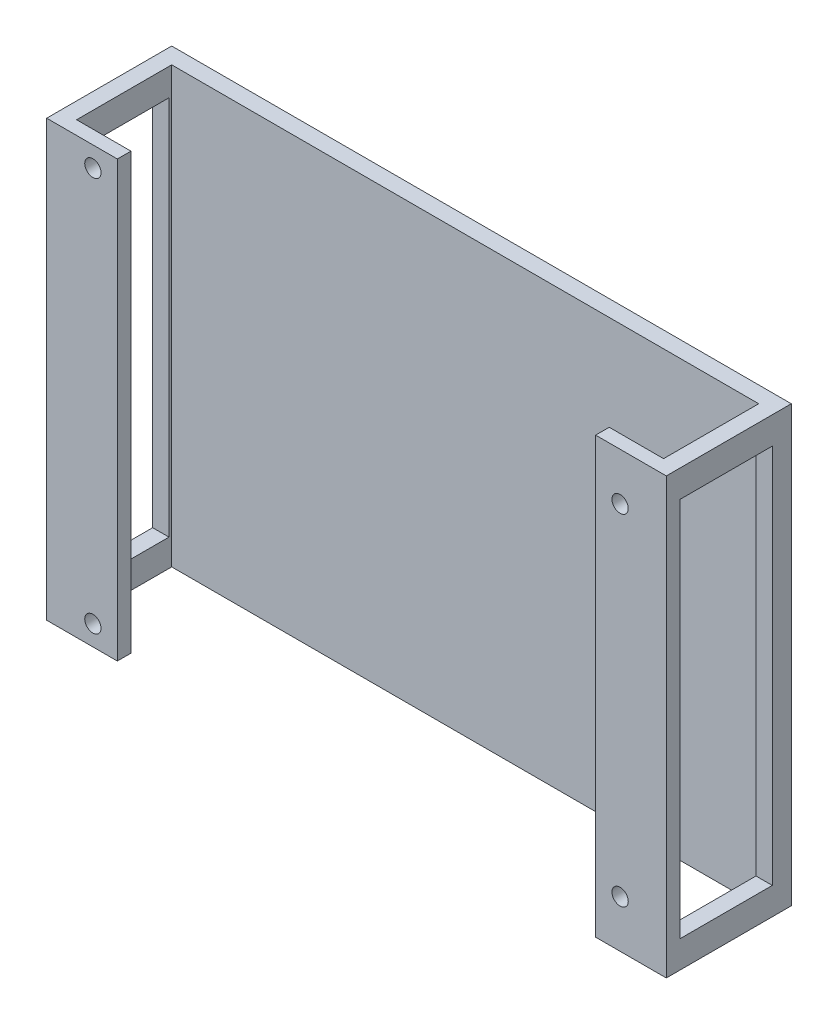
ISO-10303-21;
HEADER;
FILE_DESCRIPTION(('STEP AP214'),'2;1');
FILE_NAME('part.step','',(''),(''),'','','');
FILE_SCHEMA(('AUTOMOTIVE_DESIGN { 1 0 10303 214 1 1 1 1 }'));
ENDSEC;
DATA;
#1=APPLICATION_CONTEXT('core data for automotive mechanical design processes');
#2=APPLICATION_PROTOCOL_DEFINITION('international standard','automotive_design',2000,#1);
#3=PRODUCT_CONTEXT('',#1,'mechanical');
#4=PRODUCT('Part','Part','',(#3));
#5=PRODUCT_RELATED_PRODUCT_CATEGORY('part','',(#4));
#6=PRODUCT_DEFINITION_FORMATION('','',#4);
#7=PRODUCT_DEFINITION_CONTEXT('part definition',#1,'design');
#8=PRODUCT_DEFINITION('design','',#6,#7);
#9=PRODUCT_DEFINITION_SHAPE('','',#8);
#10=(LENGTH_UNIT() NAMED_UNIT(*) SI_UNIT(.MILLI.,.METRE.));
#11=(NAMED_UNIT(*) PLANE_ANGLE_UNIT() SI_UNIT($,.RADIAN.));
#12=(NAMED_UNIT(*) SI_UNIT($,.STERADIAN.) SOLID_ANGLE_UNIT());
#13=UNCERTAINTY_MEASURE_WITH_UNIT(LENGTH_MEASURE(1.E-05),#10,'distance_accuracy_value','');
#14=(GEOMETRIC_REPRESENTATION_CONTEXT(3) GLOBAL_UNCERTAINTY_ASSIGNED_CONTEXT((#13)) GLOBAL_UNIT_ASSIGNED_CONTEXT((#10,
#11,#12)) REPRESENTATION_CONTEXT('',''));
#15=CARTESIAN_POINT('',(0.,0.,0.));
#16=DIRECTION('',(0.,0.,1.));
#17=DIRECTION('',(1.,0.,0.));
#18=AXIS2_PLACEMENT_3D('',#15,#16,#17);
#19=CARTESIAN_POINT('',(-33.0737867172707,67.4355554296559,3.));
#20=DIRECTION('',(1.,0.,0.));
#21=DIRECTION('',(0.,1.,0.));
#22=AXIS2_PLACEMENT_3D('',#19,#20,#21);
#23=PLANE('',#22);
#24=DIRECTION('',(0.,-1.,0.));
#25=VECTOR('',#24,1.);
#26=CARTESIAN_POINT('',(-33.0737867172707,67.4355554296559,0.));
#27=LINE('',#26,#25);
#28=CARTESIAN_POINT('',(-33.0737867172707,67.4355554296559,0.));
#29=VERTEX_POINT('',#28);
#30=CARTESIAN_POINT('',(-33.0737867172707,-12.5644445703441,0.));
#31=VERTEX_POINT('',#30);
#32=EDGE_CURVE('E334',#29,#31,#27,.T.);
#33=ORIENTED_EDGE('',*,*,#32,.T.);
#34=DIRECTION('',(0.,0.,-1.));
#35=VECTOR('',#34,1.);
#36=CARTESIAN_POINT('',(-33.0737867172707,-12.5644445703441,3.));
#37=LINE('',#36,#35);
#38=CARTESIAN_POINT('',(-33.0737867172707,-12.5644445703441,23.));
#39=VERTEX_POINT('',#38);
#40=EDGE_CURVE('E336',#39,#31,#37,.T.);
#41=ORIENTED_EDGE('',*,*,#40,.F.);
#42=DIRECTION('',(0.,1.,0.));
#43=VECTOR('',#42,1.);
#44=CARTESIAN_POINT('',(-33.0737867172707,-12.5644445703441,23.));
#45=LINE('',#44,#43);
#46=CARTESIAN_POINT('',(-33.0737867172707,67.4355554296559,23.));
#47=VERTEX_POINT('',#46);
#48=EDGE_CURVE('E310',#39,#47,#45,.T.);
#49=ORIENTED_EDGE('',*,*,#48,.T.);
#50=DIRECTION('',(0.,0.,-1.));
#51=VECTOR('',#50,1.);
#52=CARTESIAN_POINT('',(-33.0737867172707,67.4355554296559,3.));
#53=LINE('',#52,#51);
#54=EDGE_CURVE('E338',#47,#29,#53,.T.);
#55=ORIENTED_EDGE('',*,*,#54,.T.);
#56=EDGE_LOOP('',(#33,#41,#49,#55));
#57=FACE_BOUND('',#56,.T.);
#58=DIRECTION('',(0.,1.,0.));
#59=VECTOR('',#58,1.);
#60=CARTESIAN_POINT('',(-33.0737867172707,-7.56444457034407,20.5));
#61=LINE('',#60,#59);
#62=CARTESIAN_POINT('',(-33.0737867172707,-7.56444457034407,20.5));
#63=VERTEX_POINT('',#62);
#64=CARTESIAN_POINT('',(-33.0737867172707,62.4355554296559,20.5));
#65=VERTEX_POINT('',#64);
#66=EDGE_CURVE('E203',#63,#65,#61,.T.);
#67=ORIENTED_EDGE('',*,*,#66,.F.);
#68=DIRECTION('',(0.,0.,1.));
#69=VECTOR('',#68,1.);
#70=CARTESIAN_POINT('',(-33.0737867172707,-7.56444457034407,3.5));
#71=LINE('',#70,#69);
#72=CARTESIAN_POINT('',(-33.0737867172707,-7.56444457034407,3.5));
#73=VERTEX_POINT('',#72);
#74=EDGE_CURVE('E181',#73,#63,#71,.T.);
#75=ORIENTED_EDGE('',*,*,#74,.F.);
#76=DIRECTION('',(0.,-1.,0.));
#77=VECTOR('',#76,1.);
#78=CARTESIAN_POINT('',(-33.0737867172707,62.4355554296559,3.49999999999999));
#79=LINE('',#78,#77);
#80=CARTESIAN_POINT('',(-33.0737867172707,62.4355554296559,3.49999999999999));
#81=VERTEX_POINT('',#80);
#82=EDGE_CURVE('E195',#81,#73,#79,.T.);
#83=ORIENTED_EDGE('',*,*,#82,.F.);
#84=DIRECTION('',(0.,0.,-1.));
#85=VECTOR('',#84,1.);
#86=CARTESIAN_POINT('',(-33.0737867172707,62.4355554296559,3.49999999999999));
#87=LINE('',#86,#85);
#88=EDGE_CURVE('E206',#65,#81,#87,.T.);
#89=ORIENTED_EDGE('',*,*,#88,.F.);
#90=EDGE_LOOP('',(#67,#75,#83,#89));
#91=FACE_BOUND('',#90,.T.);
#92=ADVANCED_FACE('F41',(#57,#91),#23,.F.);
#93=CARTESIAN_POINT('',(0.,0.,3.));
#94=DIRECTION('',(0.,0.,1.));
#95=DIRECTION('',(1.,0.,0.));
#96=AXIS2_PLACEMENT_3D('',#93,#94,#95);
#97=PLANE('',#96);
#98=DIRECTION('',(0.,-1.,0.));
#99=VECTOR('',#98,1.);
#100=CARTESIAN_POINT('',(77.9262132827293,67.4355554296559,3.));
#101=LINE('',#100,#99);
#102=CARTESIAN_POINT('',(77.9262132827293,67.4355554296559,3.));
#103=VERTEX_POINT('',#102);
#104=CARTESIAN_POINT('',(77.9262132827293,-12.5644445703441,3.));
#105=VERTEX_POINT('',#104);
#106=EDGE_CURVE('E272',#103,#105,#101,.T.);
#107=ORIENTED_EDGE('',*,*,#106,.F.);
#108=DIRECTION('',(-1.,0.,0.));
#109=VECTOR('',#108,1.);
#110=CARTESIAN_POINT('',(-33.0737867172707,67.4355554296559,3.));
#111=LINE('',#110,#109);
#112=CARTESIAN_POINT('',(-30.0737867172707,67.4355554296559,3.));
#113=VERTEX_POINT('',#112);
#114=EDGE_CURVE('E318',#103,#113,#111,.T.);
#115=ORIENTED_EDGE('',*,*,#114,.T.);
#116=DIRECTION('',(0.,-1.,0.));
#117=VECTOR('',#116,1.);
#118=CARTESIAN_POINT('',(-30.0737867172707,67.4355554296559,3.));
#119=LINE('',#118,#117);
#120=CARTESIAN_POINT('',(-30.0737867172707,-12.5644445703441,3.));
#121=VERTEX_POINT('',#120);
#122=EDGE_CURVE('E303',#113,#121,#119,.T.);
#123=ORIENTED_EDGE('',*,*,#122,.T.);
#124=DIRECTION('',(1.,0.,0.));
#125=VECTOR('',#124,1.);
#126=CARTESIAN_POINT('',(-33.0737867172707,-12.5644445703441,3.));
#127=LINE('',#126,#125);
#128=EDGE_CURVE('E321',#121,#105,#127,.T.);
#129=ORIENTED_EDGE('',*,*,#128,.T.);
#130=EDGE_LOOP('',(#107,#115,#123,#129));
#131=FACE_BOUND('',#130,.T.);
#132=ADVANCED_FACE('F371',(#131),#97,.T.);
#133=CARTESIAN_POINT('',(80.9262132827293,67.4355554296559,3.));
#134=DIRECTION('',(-1.,0.,0.));
#135=DIRECTION('',(0.,-1.,0.));
#136=AXIS2_PLACEMENT_3D('',#133,#134,#135);
#137=PLANE('',#136);
#138=DIRECTION('',(0.,0.,1.));
#139=VECTOR('',#138,1.);
#140=CARTESIAN_POINT('',(80.9262132827293,-7.56444457034406,3.5));
#141=LINE('',#140,#139);
#142=CARTESIAN_POINT('',(80.9262132827293,-7.56444457034406,3.5));
#143=VERTEX_POINT('',#142);
#144=CARTESIAN_POINT('',(80.9262132827293,-7.56444457034406,20.5));
#145=VERTEX_POINT('',#144);
#146=EDGE_CURVE('E234',#143,#145,#141,.T.);
#147=ORIENTED_EDGE('',*,*,#146,.T.);
#148=DIRECTION('',(0.,1.,0.));
#149=VECTOR('',#148,1.);
#150=CARTESIAN_POINT('',(80.9262132827293,-7.56444457034406,20.5));
#151=LINE('',#150,#149);
#152=CARTESIAN_POINT('',(80.9262132827293,62.4355554296559,20.5));
#153=VERTEX_POINT('',#152);
#154=EDGE_CURVE('E201',#145,#153,#151,.T.);
#155=ORIENTED_EDGE('',*,*,#154,.T.);
#156=DIRECTION('',(0.,0.,-1.));
#157=VECTOR('',#156,1.);
#158=CARTESIAN_POINT('',(80.9262132827293,62.4355554296559,3.49999999999999));
#159=LINE('',#158,#157);
#160=CARTESIAN_POINT('',(80.9262132827293,62.4355554296559,3.49999999999999));
#161=VERTEX_POINT('',#160);
#162=EDGE_CURVE('E191',#153,#161,#159,.T.);
#163=ORIENTED_EDGE('',*,*,#162,.T.);
#164=DIRECTION('',(0.,-1.,0.));
#165=VECTOR('',#164,1.);
#166=CARTESIAN_POINT('',(80.9262132827293,62.4355554296559,3.49999999999999));
#167=LINE('',#166,#165);
#168=EDGE_CURVE('E67',#161,#143,#167,.T.);
#169=ORIENTED_EDGE('',*,*,#168,.T.);
#170=EDGE_LOOP('',(#147,#155,#163,#169));
#171=FACE_BOUND('',#170,.T.);
#172=DIRECTION('',(0.,1.,0.));
#173=VECTOR('',#172,1.);
#174=CARTESIAN_POINT('',(80.9262132827293,67.4355554296559,0.));
#175=LINE('',#174,#173);
#176=CARTESIAN_POINT('',(80.9262132827293,-12.5644445703441,0.));
#177=VERTEX_POINT('',#176);
#178=CARTESIAN_POINT('',(80.9262132827293,67.4355554296559,0.));
#179=VERTEX_POINT('',#178);
#180=EDGE_CURVE('E320',#177,#179,#175,.T.);
#181=ORIENTED_EDGE('',*,*,#180,.T.);
#182=DIRECTION('',(0.,0.,-1.));
#183=VECTOR('',#182,1.);
#184=CARTESIAN_POINT('',(80.9262132827293,67.4355554296559,3.));
#185=LINE('',#184,#183);
#186=CARTESIAN_POINT('',(80.9262132827293,67.4355554296559,23.));
#187=VERTEX_POINT('',#186);
#188=EDGE_CURVE('E341',#187,#179,#185,.T.);
#189=ORIENTED_EDGE('',*,*,#188,.F.);
#190=DIRECTION('',(0.,1.,0.));
#191=VECTOR('',#190,1.);
#192=CARTESIAN_POINT('',(80.9262132827293,-12.5644445703441,23.));
#193=LINE('',#192,#191);
#194=CARTESIAN_POINT('',(80.9262132827293,-12.5644445703441,23.));
#195=VERTEX_POINT('',#194);
#196=EDGE_CURVE('E276',#195,#187,#193,.T.);
#197=ORIENTED_EDGE('',*,*,#196,.F.);
#198=DIRECTION('',(0.,0.,-1.));
#199=VECTOR('',#198,1.);
#200=CARTESIAN_POINT('',(80.9262132827293,-12.5644445703441,3.));
#201=LINE('',#200,#199);
#202=EDGE_CURVE('E327',#195,#177,#201,.T.);
#203=ORIENTED_EDGE('',*,*,#202,.T.);
#204=EDGE_LOOP('',(#181,#189,#197,#203));
#205=FACE_BOUND('',#204,.T.);
#206=ADVANCED_FACE('F43',(#171,#205),#137,.F.);
#207=CARTESIAN_POINT('',(-33.0737867172707,67.4355554296559,3.));
#208=DIRECTION('',(0.,-1.,0.));
#209=DIRECTION('',(0.,0.,-1.));
#210=AXIS2_PLACEMENT_3D('',#207,#208,#209);
#211=PLANE('',#210);
#212=DIRECTION('',(-1.,0.,0.));
#213=VECTOR('',#212,1.);
#214=CARTESIAN_POINT('',(-33.0737867172707,67.4355554296559,0.));
#215=LINE('',#214,#213);
#216=EDGE_CURVE('E326',#179,#29,#215,.T.);
#217=ORIENTED_EDGE('',*,*,#216,.T.);
#218=ORIENTED_EDGE('',*,*,#54,.F.);
#219=DIRECTION('',(1.,0.,0.));
#220=VECTOR('',#219,1.);
#221=CARTESIAN_POINT('',(-33.0737867172707,67.4355554296559,23.));
#222=LINE('',#221,#220);
#223=CARTESIAN_POINT('',(-20.0737867172707,67.4355554296559,23.));
#224=VERTEX_POINT('',#223);
#225=EDGE_CURVE('E309',#47,#224,#222,.T.);
#226=ORIENTED_EDGE('',*,*,#225,.T.);
#227=DIRECTION('',(0.,0.,1.));
#228=VECTOR('',#227,1.);
#229=CARTESIAN_POINT('',(-20.0737867172707,67.4355554296559,23.));
#230=LINE('',#229,#228);
#231=CARTESIAN_POINT('',(-20.0737867172707,67.4355554296559,20.5));
#232=VERTEX_POINT('',#231);
#233=EDGE_CURVE('E295',#232,#224,#230,.T.);
#234=ORIENTED_EDGE('',*,*,#233,.F.);
#235=DIRECTION('',(-1.,0.,0.));
#236=VECTOR('',#235,1.);
#237=CARTESIAN_POINT('',(-20.0737867172707,67.4355554296559,20.5));
#238=LINE('',#237,#236);
#239=CARTESIAN_POINT('',(-30.0737867172707,67.4355554296559,20.5));
#240=VERTEX_POINT('',#239);
#241=EDGE_CURVE('E300',#232,#240,#238,.T.);
#242=ORIENTED_EDGE('',*,*,#241,.T.);
#243=DIRECTION('',(0.,0.,-1.));
#244=VECTOR('',#243,1.);
#245=CARTESIAN_POINT('',(-30.0737867172707,67.4355554296559,23.));
#246=LINE('',#245,#244);
#247=EDGE_CURVE('E315',#240,#113,#246,.T.);
#248=ORIENTED_EDGE('',*,*,#247,.T.);
#249=ORIENTED_EDGE('',*,*,#114,.F.);
#250=DIRECTION('',(0.,0.,-1.));
#251=VECTOR('',#250,1.);
#252=CARTESIAN_POINT('',(77.9262132827293,67.4355554296559,23.));
#253=LINE('',#252,#251);
#254=CARTESIAN_POINT('',(77.9262132827293,67.4355554296559,20.5));
#255=VERTEX_POINT('',#254);
#256=EDGE_CURVE('E285',#255,#103,#253,.T.);
#257=ORIENTED_EDGE('',*,*,#256,.F.);
#258=DIRECTION('',(1.,0.,0.));
#259=VECTOR('',#258,1.);
#260=CARTESIAN_POINT('',(67.9262132827293,67.4355554296559,20.5));
#261=LINE('',#260,#259);
#262=CARTESIAN_POINT('',(67.9262132827293,67.4355554296559,20.5));
#263=VERTEX_POINT('',#262);
#264=EDGE_CURVE('E267',#263,#255,#261,.T.);
#265=ORIENTED_EDGE('',*,*,#264,.F.);
#266=DIRECTION('',(0.,0.,1.));
#267=VECTOR('',#266,1.);
#268=CARTESIAN_POINT('',(67.9262132827293,67.4355554296559,23.));
#269=LINE('',#268,#267);
#270=CARTESIAN_POINT('',(67.9262132827293,67.4355554296559,23.));
#271=VERTEX_POINT('',#270);
#272=EDGE_CURVE('E253',#263,#271,#269,.T.);
#273=ORIENTED_EDGE('',*,*,#272,.T.);
#274=DIRECTION('',(-1.,0.,0.));
#275=VECTOR('',#274,1.);
#276=CARTESIAN_POINT('',(80.9262132827293,67.4355554296559,23.));
#277=LINE('',#276,#275);
#278=EDGE_CURVE('E273',#187,#271,#277,.T.);
#279=ORIENTED_EDGE('',*,*,#278,.F.);
#280=ORIENTED_EDGE('',*,*,#188,.T.);
#281=EDGE_LOOP('',(#217,#218,#226,#234,#242,#248,#249,#257,#265,#273,#279,#280));
#282=FACE_BOUND('',#281,.T.);
#283=ADVANCED_FACE('F381',(#282),#211,.F.);
#284=CARTESIAN_POINT('',(-33.0737867172707,-12.5644445703441,3.));
#285=DIRECTION('',(0.,1.,0.));
#286=DIRECTION('',(0.,0.,1.));
#287=AXIS2_PLACEMENT_3D('',#284,#285,#286);
#288=PLANE('',#287);
#289=ORIENTED_EDGE('',*,*,#128,.F.);
#290=DIRECTION('',(0.,0.,-1.));
#291=VECTOR('',#290,1.);
#292=CARTESIAN_POINT('',(-30.0737867172707,-12.5644445703441,23.));
#293=LINE('',#292,#291);
#294=CARTESIAN_POINT('',(-30.0737867172707,-12.5644445703441,20.5));
#295=VERTEX_POINT('',#294);
#296=EDGE_CURVE('E314',#295,#121,#293,.T.);
#297=ORIENTED_EDGE('',*,*,#296,.F.);
#298=DIRECTION('',(-1.,0.,0.));
#299=VECTOR('',#298,1.);
#300=CARTESIAN_POINT('',(-20.0737867172707,-12.5644445703441,20.5));
#301=LINE('',#300,#299);
#302=CARTESIAN_POINT('',(-20.0737867172707,-12.5644445703441,20.5));
#303=VERTEX_POINT('',#302);
#304=EDGE_CURVE('E301',#303,#295,#301,.T.);
#305=ORIENTED_EDGE('',*,*,#304,.F.);
#306=DIRECTION('',(0.,0.,-1.));
#307=VECTOR('',#306,1.);
#308=CARTESIAN_POINT('',(-20.0737867172707,-12.5644445703441,20.5));
#309=LINE('',#308,#307);
#310=CARTESIAN_POINT('',(-20.0737867172707,-12.5644445703441,23.));
#311=VERTEX_POINT('',#310);
#312=EDGE_CURVE('E286',#311,#303,#309,.T.);
#313=ORIENTED_EDGE('',*,*,#312,.F.);
#314=DIRECTION('',(-1.,0.,0.));
#315=VECTOR('',#314,1.);
#316=CARTESIAN_POINT('',(-30.0737867172707,-12.5644445703441,23.));
#317=LINE('',#316,#315);
#318=EDGE_CURVE('E302',#311,#39,#317,.T.);
#319=ORIENTED_EDGE('',*,*,#318,.T.);
#320=ORIENTED_EDGE('',*,*,#40,.T.);
#321=DIRECTION('',(1.,0.,0.));
#322=VECTOR('',#321,1.);
#323=CARTESIAN_POINT('',(-33.0737867172707,-12.5644445703441,0.));
#324=LINE('',#323,#322);
#325=EDGE_CURVE('E325',#31,#177,#324,.T.);
#326=ORIENTED_EDGE('',*,*,#325,.T.);
#327=ORIENTED_EDGE('',*,*,#202,.F.);
#328=DIRECTION('',(1.,0.,0.));
#329=VECTOR('',#328,1.);
#330=CARTESIAN_POINT('',(77.9262132827293,-12.5644445703441,23.));
#331=LINE('',#330,#329);
#332=CARTESIAN_POINT('',(67.9262132827293,-12.5644445703441,23.));
#333=VERTEX_POINT('',#332);
#334=EDGE_CURVE('E275',#333,#195,#331,.T.);
#335=ORIENTED_EDGE('',*,*,#334,.F.);
#336=DIRECTION('',(0.,0.,-1.));
#337=VECTOR('',#336,1.);
#338=CARTESIAN_POINT('',(67.9262132827293,-12.5644445703441,20.5));
#339=LINE('',#338,#337);
#340=CARTESIAN_POINT('',(67.9262132827293,-12.5644445703441,20.5));
#341=VERTEX_POINT('',#340);
#342=EDGE_CURVE('E262',#333,#341,#339,.T.);
#343=ORIENTED_EDGE('',*,*,#342,.T.);
#344=DIRECTION('',(1.,0.,0.));
#345=VECTOR('',#344,1.);
#346=CARTESIAN_POINT('',(67.9262132827293,-12.5644445703441,20.5));
#347=LINE('',#346,#345);
#348=CARTESIAN_POINT('',(77.9262132827293,-12.5644445703441,20.5));
#349=VERTEX_POINT('',#348);
#350=EDGE_CURVE('E261',#341,#349,#347,.T.);
#351=ORIENTED_EDGE('',*,*,#350,.T.);
#352=DIRECTION('',(0.,0.,-1.));
#353=VECTOR('',#352,1.);
#354=CARTESIAN_POINT('',(77.9262132827293,-12.5644445703441,23.));
#355=LINE('',#354,#353);
#356=EDGE_CURVE('E277',#349,#105,#355,.T.);
#357=ORIENTED_EDGE('',*,*,#356,.T.);
#358=EDGE_LOOP('',(#289,#297,#305,#313,#319,#320,#326,#327,#335,#343,#351,#357));
#359=FACE_BOUND('',#358,.T.);
#360=ADVANCED_FACE('F385',(#359),#288,.F.);
#361=CARTESIAN_POINT('',(0.,0.,0.));
#362=DIRECTION('',(0.,0.,1.));
#363=DIRECTION('',(1.,0.,0.));
#364=AXIS2_PLACEMENT_3D('',#361,#362,#363);
#365=PLANE('',#364);
#366=ORIENTED_EDGE('',*,*,#180,.F.);
#367=ORIENTED_EDGE('',*,*,#325,.F.);
#368=ORIENTED_EDGE('',*,*,#32,.F.);
#369=ORIENTED_EDGE('',*,*,#216,.F.);
#370=EDGE_LOOP('',(#366,#367,#368,#369));
#371=FACE_BOUND('',#370,.T.);
#372=ADVANCED_FACE('F387',(#371),#365,.F.);
#373=CARTESIAN_POINT('',(-30.0737867172707,67.4355554296559,23.));
#374=DIRECTION('',(1.,0.,0.));
#375=DIRECTION('',(0.,1.,0.));
#376=AXIS2_PLACEMENT_3D('',#373,#374,#375);
#377=PLANE('',#376);
#378=DIRECTION('',(0.,0.,-1.));
#379=VECTOR('',#378,1.);
#380=CARTESIAN_POINT('',(-30.0737867172707,-7.56444457034407,23.));
#381=LINE('',#380,#379);
#382=CARTESIAN_POINT('',(-30.0737867172707,-7.56444457034407,20.5));
#383=VERTEX_POINT('',#382);
#384=CARTESIAN_POINT('',(-30.0737867172707,-7.56444457034407,3.5));
#385=VERTEX_POINT('',#384);
#386=EDGE_CURVE('E248',#383,#385,#381,.T.);
#387=ORIENTED_EDGE('',*,*,#386,.F.);
#388=DIRECTION('',(0.,1.,0.));
#389=VECTOR('',#388,1.);
#390=CARTESIAN_POINT('',(-30.0737867172707,67.4355554296559,20.5));
#391=LINE('',#390,#389);
#392=EDGE_CURVE('E202',#295,#383,#391,.T.);
#393=ORIENTED_EDGE('',*,*,#392,.F.);
#394=ORIENTED_EDGE('',*,*,#296,.T.);
#395=ORIENTED_EDGE('',*,*,#122,.F.);
#396=ORIENTED_EDGE('',*,*,#247,.F.);
#397=CARTESIAN_POINT('',(-30.0737867172707,62.4355554296559,20.5));
#398=VERTEX_POINT('',#397);
#399=EDGE_CURVE('E283',#398,#240,#391,.T.);
#400=ORIENTED_EDGE('',*,*,#399,.F.);
#401=DIRECTION('',(0.,0.,1.));
#402=VECTOR('',#401,1.);
#403=CARTESIAN_POINT('',(-30.0737867172707,62.4355554296559,23.));
#404=LINE('',#403,#402);
#405=CARTESIAN_POINT('',(-30.0737867172707,62.4355554296559,3.49999999999999));
#406=VERTEX_POINT('',#405);
#407=EDGE_CURVE('E245',#406,#398,#404,.T.);
#408=ORIENTED_EDGE('',*,*,#407,.F.);
#409=DIRECTION('',(0.,1.,0.));
#410=VECTOR('',#409,1.);
#411=CARTESIAN_POINT('',(-30.0737867172707,67.4355554296559,3.49999999999999));
#412=LINE('',#411,#410);
#413=EDGE_CURVE('E246',#385,#406,#412,.T.);
#414=ORIENTED_EDGE('',*,*,#413,.F.);
#415=EDGE_LOOP('',(#387,#393,#394,#395,#396,#400,#408,#414));
#416=FACE_BOUND('',#415,.T.);
#417=ADVANCED_FACE('F419',(#416),#377,.T.);
#418=CARTESIAN_POINT('',(0.,0.,23.));
#419=DIRECTION('',(0.,0.,-1.));
#420=DIRECTION('',(-1.,0.,0.));
#421=AXIS2_PLACEMENT_3D('',#418,#419,#420);
#422=PLANE('',#421);
#423=CARTESIAN_POINT('',(-24.5737867172647,63.7285797705887,23.));
#424=DIRECTION('',(0.,0.,1.));
#425=DIRECTION('',(1.,0.,0.));
#426=AXIS2_PLACEMENT_3D('',#423,#424,#425);
#427=CIRCLE('',#426,1.5);
#428=CARTESIAN_POINT('',(-23.0737867172647,63.7285797705887,23.));
#429=VERTEX_POINT('',#428);
#430=EDGE_CURVE('E216',#429,#429,#427,.T.);
#431=ORIENTED_EDGE('',*,*,#430,.F.);
#432=EDGE_LOOP('',(#431));
#433=FACE_BOUND('',#432,.T.);
#434=CARTESIAN_POINT('',(-24.5737867172647,-8.857468911273,23.));
#435=DIRECTION('',(0.,0.,1.));
#436=DIRECTION('',(1.,0.,0.));
#437=AXIS2_PLACEMENT_3D('',#434,#435,#436);
#438=CIRCLE('',#437,1.5);
#439=CARTESIAN_POINT('',(-23.0737867172647,-8.857468911273,23.));
#440=VERTEX_POINT('',#439);
#441=EDGE_CURVE('E222',#440,#440,#438,.T.);
#442=ORIENTED_EDGE('',*,*,#441,.F.);
#443=EDGE_LOOP('',(#442));
#444=FACE_BOUND('',#443,.T.);
#445=ORIENTED_EDGE('',*,*,#318,.F.);
#446=DIRECTION('',(0.,-1.,0.));
#447=VECTOR('',#446,1.);
#448=CARTESIAN_POINT('',(-20.0737867172707,-12.5644445703441,23.));
#449=LINE('',#448,#447);
#450=EDGE_CURVE('E289',#224,#311,#449,.T.);
#451=ORIENTED_EDGE('',*,*,#450,.F.);
#452=ORIENTED_EDGE('',*,*,#225,.F.);
#453=ORIENTED_EDGE('',*,*,#48,.F.);
#454=EDGE_LOOP('',(#445,#451,#452,#453));
#455=FACE_BOUND('',#454,.T.);
#456=ADVANCED_FACE('F402',(#433,#444,#455),#422,.F.);
#457=CARTESIAN_POINT('',(-20.0737867172707,67.4355554296559,20.5));
#458=DIRECTION('',(0.,0.,1.));
#459=DIRECTION('',(0.,-1.,0.));
#460=AXIS2_PLACEMENT_3D('',#457,#458,#459);
#461=PLANE('',#460);
#462=CARTESIAN_POINT('',(-24.5737867172647,63.7285797705887,20.5));
#463=DIRECTION('',(0.,0.,1.));
#464=DIRECTION('',(0.,-1.,0.));
#465=AXIS2_PLACEMENT_3D('',#462,#463,#464);
#466=CIRCLE('',#465,1.5);
#467=CARTESIAN_POINT('',(-24.5737867172647,62.2285797705887,20.5));
#468=VERTEX_POINT('',#467);
#469=EDGE_CURVE('E44',#468,#468,#466,.T.);
#470=ORIENTED_EDGE('',*,*,#469,.T.);
#471=EDGE_LOOP('',(#470));
#472=FACE_BOUND('',#471,.T.);
#473=ORIENTED_EDGE('',*,*,#241,.F.);
#474=DIRECTION('',(0.,1.,0.));
#475=VECTOR('',#474,1.);
#476=CARTESIAN_POINT('',(-20.0737867172707,67.4355554296559,20.5));
#477=LINE('',#476,#475);
#478=EDGE_CURVE('E292',#303,#232,#477,.T.);
#479=ORIENTED_EDGE('',*,*,#478,.F.);
#480=ORIENTED_EDGE('',*,*,#304,.T.);
#481=ORIENTED_EDGE('',*,*,#392,.T.);
#482=DIRECTION('',(-1.,0.,0.));
#483=VECTOR('',#482,1.);
#484=CARTESIAN_POINT('',(80.9262132827293,-7.56444457034406,20.5));
#485=LINE('',#484,#483);
#486=EDGE_CURVE('E183',#383,#63,#485,.T.);
#487=ORIENTED_EDGE('',*,*,#486,.T.);
#488=ORIENTED_EDGE('',*,*,#66,.T.);
#489=DIRECTION('',(-1.,0.,0.));
#490=VECTOR('',#489,1.);
#491=CARTESIAN_POINT('',(80.9262132827293,62.4355554296559,20.5));
#492=LINE('',#491,#490);
#493=EDGE_CURVE('E217',#398,#65,#492,.T.);
#494=ORIENTED_EDGE('',*,*,#493,.F.);
#495=ORIENTED_EDGE('',*,*,#399,.T.);
#496=EDGE_LOOP('',(#473,#479,#480,#481,#487,#488,#494,#495));
#497=FACE_BOUND('',#496,.T.);
#498=CARTESIAN_POINT('',(-24.5737867172647,-8.857468911273,20.5));
#499=DIRECTION('',(0.,0.,1.));
#500=DIRECTION('',(0.,-1.,0.));
#501=AXIS2_PLACEMENT_3D('',#498,#499,#500);
#502=CIRCLE('',#501,1.5);
#503=CARTESIAN_POINT('',(-24.5737867172647,-10.357468911273,20.5));
#504=VERTEX_POINT('',#503);
#505=EDGE_CURVE('E353',#504,#504,#502,.T.);
#506=ORIENTED_EDGE('',*,*,#505,.T.);
#507=EDGE_LOOP('',(#506));
#508=FACE_BOUND('',#507,.T.);
#509=ADVANCED_FACE('F200',(#472,#497,#508),#461,.F.);
#510=CARTESIAN_POINT('',(-20.0737867172707,0.,0.));
#511=DIRECTION('',(-1.,0.,0.));
#512=DIRECTION('',(0.,-1.,0.));
#513=AXIS2_PLACEMENT_3D('',#510,#511,#512);
#514=PLANE('',#513);
#515=ORIENTED_EDGE('',*,*,#450,.T.);
#516=ORIENTED_EDGE('',*,*,#312,.T.);
#517=ORIENTED_EDGE('',*,*,#478,.T.);
#518=ORIENTED_EDGE('',*,*,#233,.T.);
#519=EDGE_LOOP('',(#515,#516,#517,#518));
#520=FACE_BOUND('',#519,.T.);
#521=ADVANCED_FACE('F408',(#520),#514,.F.);
#522=CARTESIAN_POINT('',(77.9262132827293,67.4355554296559,23.));
#523=DIRECTION('',(1.,0.,0.));
#524=DIRECTION('',(0.,1.,0.));
#525=AXIS2_PLACEMENT_3D('',#522,#523,#524);
#526=PLANE('',#525);
#527=DIRECTION('',(0.,1.,0.));
#528=VECTOR('',#527,1.);
#529=CARTESIAN_POINT('',(77.9262132827293,67.4355554296559,20.5));
#530=LINE('',#529,#528);
#531=CARTESIAN_POINT('',(77.9262132827293,-7.56444457034406,20.5));
#532=VERTEX_POINT('',#531);
#533=EDGE_CURVE('E259',#349,#532,#530,.T.);
#534=ORIENTED_EDGE('',*,*,#533,.T.);
#535=DIRECTION('',(0.,0.,-1.));
#536=VECTOR('',#535,1.);
#537=CARTESIAN_POINT('',(77.9262132827293,-7.56444457034405,23.));
#538=LINE('',#537,#536);
#539=CARTESIAN_POINT('',(77.9262132827293,-7.56444457034406,3.5));
#540=VERTEX_POINT('',#539);
#541=EDGE_CURVE('E11',#532,#540,#538,.T.);
#542=ORIENTED_EDGE('',*,*,#541,.T.);
#543=DIRECTION('',(0.,1.,0.));
#544=VECTOR('',#543,1.);
#545=CARTESIAN_POINT('',(77.9262132827293,67.4355554296559,3.49999999999999));
#546=LINE('',#545,#544);
#547=CARTESIAN_POINT('',(77.9262132827293,62.4355554296559,3.49999999999999));
#548=VERTEX_POINT('',#547);
#549=EDGE_CURVE('E49',#540,#548,#546,.T.);
#550=ORIENTED_EDGE('',*,*,#549,.T.);
#551=DIRECTION('',(0.,0.,1.));
#552=VECTOR('',#551,1.);
#553=CARTESIAN_POINT('',(77.9262132827293,62.4355554296559,23.));
#554=LINE('',#553,#552);
#555=CARTESIAN_POINT('',(77.9262132827293,62.4355554296559,20.5));
#556=VERTEX_POINT('',#555);
#557=EDGE_CURVE('E59',#548,#556,#554,.T.);
#558=ORIENTED_EDGE('',*,*,#557,.T.);
#559=EDGE_CURVE('E252',#556,#255,#530,.T.);
#560=ORIENTED_EDGE('',*,*,#559,.T.);
#561=ORIENTED_EDGE('',*,*,#256,.T.);
#562=ORIENTED_EDGE('',*,*,#106,.T.);
#563=ORIENTED_EDGE('',*,*,#356,.F.);
#564=EDGE_LOOP('',(#534,#542,#550,#558,#560,#561,#562,#563));
#565=FACE_BOUND('',#564,.T.);
#566=ADVANCED_FACE('F423',(#565),#526,.F.);
#567=CARTESIAN_POINT('',(47.8524265654587,0.,23.));
#568=DIRECTION('',(0.,0.,-1.));
#569=DIRECTION('',(1.,0.,0.));
#570=AXIS2_PLACEMENT_3D('',#567,#568,#569);
#571=PLANE('',#570);
#572=CARTESIAN_POINT('',(72.4262132827352,-3.85746891127326,23.));
#573=DIRECTION('',(0.,0.,1.));
#574=DIRECTION('',(1.,0.,0.));
#575=AXIS2_PLACEMENT_3D('',#572,#573,#574);
#576=CIRCLE('',#575,1.5);
#577=CARTESIAN_POINT('',(73.9262132827352,-3.85746891127326,23.));
#578=VERTEX_POINT('',#577);
#579=EDGE_CURVE('E212',#578,#578,#576,.T.);
#580=ORIENTED_EDGE('',*,*,#579,.F.);
#581=EDGE_LOOP('',(#580));
#582=FACE_BOUND('',#581,.T.);
#583=CARTESIAN_POINT('',(72.4262132827352,58.7285797705887,23.));
#584=DIRECTION('',(0.,0.,1.));
#585=DIRECTION('',(1.,0.,0.));
#586=AXIS2_PLACEMENT_3D('',#583,#584,#585);
#587=CIRCLE('',#586,1.5);
#588=CARTESIAN_POINT('',(73.9262132827352,58.7285797705887,23.));
#589=VERTEX_POINT('',#588);
#590=EDGE_CURVE('E228',#589,#589,#587,.T.);
#591=ORIENTED_EDGE('',*,*,#590,.F.);
#592=EDGE_LOOP('',(#591));
#593=FACE_BOUND('',#592,.T.);
#594=ORIENTED_EDGE('',*,*,#334,.T.);
#595=ORIENTED_EDGE('',*,*,#196,.T.);
#596=ORIENTED_EDGE('',*,*,#278,.T.);
#597=DIRECTION('',(0.,-1.,0.));
#598=VECTOR('',#597,1.);
#599=CARTESIAN_POINT('',(67.9262132827293,-12.5644445703441,23.));
#600=LINE('',#599,#598);
#601=EDGE_CURVE('E255',#271,#333,#600,.T.);
#602=ORIENTED_EDGE('',*,*,#601,.T.);
#603=EDGE_LOOP('',(#594,#595,#596,#602));
#604=FACE_BOUND('',#603,.T.);
#605=ADVANCED_FACE('F433',(#582,#593,#604),#571,.F.);
#606=CARTESIAN_POINT('',(67.9262132827293,67.4355554296559,20.5));
#607=DIRECTION('',(0.,0.,-1.));
#608=DIRECTION('',(0.,1.,0.));
#609=AXIS2_PLACEMENT_3D('',#606,#607,#608);
#610=PLANE('',#609);
#611=DIRECTION('',(0.,1.,0.));
#612=VECTOR('',#611,1.);
#613=CARTESIAN_POINT('',(67.9262132827293,67.4355554296559,20.5));
#614=LINE('',#613,#612);
#615=EDGE_CURVE('E258',#341,#263,#614,.T.);
#616=ORIENTED_EDGE('',*,*,#615,.T.);
#617=ORIENTED_EDGE('',*,*,#264,.T.);
#618=ORIENTED_EDGE('',*,*,#559,.F.);
#619=EDGE_CURVE('E213',#153,#556,#492,.T.);
#620=ORIENTED_EDGE('',*,*,#619,.F.);
#621=ORIENTED_EDGE('',*,*,#154,.F.);
#622=EDGE_CURVE('E205',#145,#532,#485,.T.);
#623=ORIENTED_EDGE('',*,*,#622,.T.);
#624=ORIENTED_EDGE('',*,*,#533,.F.);
#625=ORIENTED_EDGE('',*,*,#350,.F.);
#626=EDGE_LOOP('',(#616,#617,#618,#620,#621,#623,#624,#625));
#627=FACE_BOUND('',#626,.T.);
#628=CARTESIAN_POINT('',(72.4262132827352,-3.85746891127326,20.5));
#629=DIRECTION('',(0.,0.,-1.));
#630=DIRECTION('',(0.,1.,0.));
#631=AXIS2_PLACEMENT_3D('',#628,#629,#630);
#632=CIRCLE('',#631,1.5);
#633=CARTESIAN_POINT('',(72.4262132827352,-2.35746891127326,20.5));
#634=VERTEX_POINT('',#633);
#635=EDGE_CURVE('E346',#634,#634,#632,.T.);
#636=ORIENTED_EDGE('',*,*,#635,.F.);
#637=EDGE_LOOP('',(#636));
#638=FACE_BOUND('',#637,.T.);
#639=CARTESIAN_POINT('',(72.4262132827352,58.7285797705887,20.5));
#640=DIRECTION('',(0.,0.,-1.));
#641=DIRECTION('',(0.,1.,0.));
#642=AXIS2_PLACEMENT_3D('',#639,#640,#641);
#643=CIRCLE('',#642,1.5);
#644=CARTESIAN_POINT('',(72.4262132827352,60.2285797705887,20.5));
#645=VERTEX_POINT('',#644);
#646=EDGE_CURVE('E224',#645,#645,#643,.T.);
#647=ORIENTED_EDGE('',*,*,#646,.F.);
#648=EDGE_LOOP('',(#647));
#649=FACE_BOUND('',#648,.T.);
#650=ADVANCED_FACE('F440',(#627,#638,#649),#610,.T.);
#651=CARTESIAN_POINT('',(67.9262132827293,0.,0.));
#652=DIRECTION('',(1.,0.,0.));
#653=DIRECTION('',(0.,-1.,0.));
#654=AXIS2_PLACEMENT_3D('',#651,#652,#653);
#655=PLANE('',#654);
#656=ORIENTED_EDGE('',*,*,#601,.F.);
#657=ORIENTED_EDGE('',*,*,#272,.F.);
#658=ORIENTED_EDGE('',*,*,#615,.F.);
#659=ORIENTED_EDGE('',*,*,#342,.F.);
#660=EDGE_LOOP('',(#656,#657,#658,#659));
#661=FACE_BOUND('',#660,.T.);
#662=ADVANCED_FACE('F427',(#661),#655,.F.);
#663=CARTESIAN_POINT('',(80.9262132827293,62.4355554296559,3.49999999999999));
#664=DIRECTION('',(0.,1.,0.));
#665=DIRECTION('',(-1.,0.,0.));
#666=AXIS2_PLACEMENT_3D('',#663,#664,#665);
#667=PLANE('',#666);
#668=DIRECTION('',(-1.,0.,0.));
#669=VECTOR('',#668,1.);
#670=CARTESIAN_POINT('',(80.9262132827293,62.4355554296559,3.49999999999999));
#671=LINE('',#670,#669);
#672=EDGE_CURVE('E243',#161,#548,#671,.T.);
#673=ORIENTED_EDGE('',*,*,#672,.F.);
#674=ORIENTED_EDGE('',*,*,#162,.F.);
#675=ORIENTED_EDGE('',*,*,#619,.T.);
#676=ORIENTED_EDGE('',*,*,#557,.F.);
#677=EDGE_LOOP('',(#673,#674,#675,#676));
#678=FACE_BOUND('',#677,.T.);
#679=ADVANCED_FACE('F524',(#678),#667,.F.);
#680=CARTESIAN_POINT('',(80.9262132827293,62.4355554296559,3.49999999999999));
#681=DIRECTION('',(0.,0.,-1.));
#682=DIRECTION('',(0.,1.,0.));
#683=AXIS2_PLACEMENT_3D('',#680,#681,#682);
#684=PLANE('',#683);
#685=DIRECTION('',(-1.,0.,0.));
#686=VECTOR('',#685,1.);
#687=CARTESIAN_POINT('',(80.9262132827293,-7.56444457034406,3.5));
#688=LINE('',#687,#686);
#689=EDGE_CURVE('E237',#143,#540,#688,.T.);
#690=ORIENTED_EDGE('',*,*,#689,.F.);
#691=ORIENTED_EDGE('',*,*,#168,.F.);
#692=ORIENTED_EDGE('',*,*,#672,.T.);
#693=ORIENTED_EDGE('',*,*,#549,.F.);
#694=EDGE_LOOP('',(#690,#691,#692,#693));
#695=FACE_BOUND('',#694,.T.);
#696=ADVANCED_FACE('F530',(#695),#684,.F.);
#697=CARTESIAN_POINT('',(80.9262132827293,-7.56444457034406,3.5));
#698=DIRECTION('',(0.,-1.,0.));
#699=DIRECTION('',(1.,0.,0.));
#700=AXIS2_PLACEMENT_3D('',#697,#698,#699);
#701=PLANE('',#700);
#702=ORIENTED_EDGE('',*,*,#541,.F.);
#703=ORIENTED_EDGE('',*,*,#622,.F.);
#704=ORIENTED_EDGE('',*,*,#146,.F.);
#705=ORIENTED_EDGE('',*,*,#689,.T.);
#706=EDGE_LOOP('',(#702,#703,#704,#705));
#707=FACE_BOUND('',#706,.T.);
#708=ADVANCED_FACE('F537',(#707),#701,.F.);
#709=ORIENTED_EDGE('',*,*,#386,.T.);
#710=EDGE_CURVE('E190',#385,#73,#688,.T.);
#711=ORIENTED_EDGE('',*,*,#710,.T.);
#712=ORIENTED_EDGE('',*,*,#74,.T.);
#713=ORIENTED_EDGE('',*,*,#486,.F.);
#714=EDGE_LOOP('',(#709,#711,#712,#713));
#715=FACE_BOUND('',#714,.T.);
#716=ADVANCED_FACE('F182',(#715),#701,.F.);
#717=ORIENTED_EDGE('',*,*,#413,.T.);
#718=EDGE_CURVE('E236',#406,#81,#671,.T.);
#719=ORIENTED_EDGE('',*,*,#718,.T.);
#720=ORIENTED_EDGE('',*,*,#82,.T.);
#721=ORIENTED_EDGE('',*,*,#710,.F.);
#722=EDGE_LOOP('',(#717,#719,#720,#721));
#723=FACE_BOUND('',#722,.T.);
#724=ADVANCED_FACE('F544',(#723),#684,.F.);
#725=ORIENTED_EDGE('',*,*,#407,.T.);
#726=ORIENTED_EDGE('',*,*,#493,.T.);
#727=ORIENTED_EDGE('',*,*,#88,.T.);
#728=ORIENTED_EDGE('',*,*,#718,.F.);
#729=EDGE_LOOP('',(#725,#726,#727,#728));
#730=FACE_BOUND('',#729,.T.);
#731=ADVANCED_FACE('F535',(#730),#667,.F.);
#732=CARTESIAN_POINT('',(72.4262132827352,58.7285797705887,13.));
#733=DIRECTION('',(0.,0.,1.));
#734=DIRECTION('',(1.,0.,0.));
#735=AXIS2_PLACEMENT_3D('',#732,#733,#734);
#736=CYLINDRICAL_SURFACE('',#735,1.5);
#737=ORIENTED_EDGE('',*,*,#646,.T.);
#738=EDGE_LOOP('',(#737));
#739=FACE_BOUND('',#738,.T.);
#740=ORIENTED_EDGE('',*,*,#590,.T.);
#741=EDGE_LOOP('',(#740));
#742=FACE_BOUND('',#741,.T.);
#743=ADVANCED_FACE('F575',(#739,#742),#736,.F.);
#744=CARTESIAN_POINT('',(72.4262132827352,-3.85746891127326,13.));
#745=DIRECTION('',(0.,0.,1.));
#746=DIRECTION('',(1.,0.,0.));
#747=AXIS2_PLACEMENT_3D('',#744,#745,#746);
#748=CYLINDRICAL_SURFACE('',#747,1.5);
#749=ORIENTED_EDGE('',*,*,#635,.T.);
#750=EDGE_LOOP('',(#749));
#751=FACE_BOUND('',#750,.T.);
#752=ORIENTED_EDGE('',*,*,#579,.T.);
#753=EDGE_LOOP('',(#752));
#754=FACE_BOUND('',#753,.T.);
#755=ADVANCED_FACE('F366',(#751,#754),#748,.F.);
#756=CARTESIAN_POINT('',(-24.5737867172647,-8.857468911273,13.));
#757=DIRECTION('',(0.,0.,1.));
#758=DIRECTION('',(1.,0.,0.));
#759=AXIS2_PLACEMENT_3D('',#756,#757,#758);
#760=CYLINDRICAL_SURFACE('',#759,1.5);
#761=ORIENTED_EDGE('',*,*,#441,.T.);
#762=EDGE_LOOP('',(#761));
#763=FACE_BOUND('',#762,.T.);
#764=ORIENTED_EDGE('',*,*,#505,.F.);
#765=EDGE_LOOP('',(#764));
#766=FACE_BOUND('',#765,.T.);
#767=ADVANCED_FACE('F359',(#763,#766),#760,.F.);
#768=CARTESIAN_POINT('',(-24.5737867172647,63.7285797705887,13.));
#769=DIRECTION('',(0.,0.,1.));
#770=DIRECTION('',(1.,0.,0.));
#771=AXIS2_PLACEMENT_3D('',#768,#769,#770);
#772=CYLINDRICAL_SURFACE('',#771,1.5);
#773=ORIENTED_EDGE('',*,*,#430,.T.);
#774=EDGE_LOOP('',(#773));
#775=FACE_BOUND('',#774,.T.);
#776=ORIENTED_EDGE('',*,*,#469,.F.);
#777=EDGE_LOOP('',(#776));
#778=FACE_BOUND('',#777,.T.);
#779=ADVANCED_FACE('F356',(#775,#778),#772,.F.);
#780=CLOSED_SHELL('',(#92,#132,#206,#283,#360,#372,#417,#456,#509,#521,#566,#605,#650,#662,#679,
#696,#708,#716,#724,#731,#743,#755,#767,#779));
#781=MANIFOLD_SOLID_BREP('B2',#780);
#782=ADVANCED_BREP_SHAPE_REPRESENTATION('',(#18,#781),#14);
#783=SHAPE_DEFINITION_REPRESENTATION(#9,#782);
ENDSEC;
END-ISO-10303-21;
